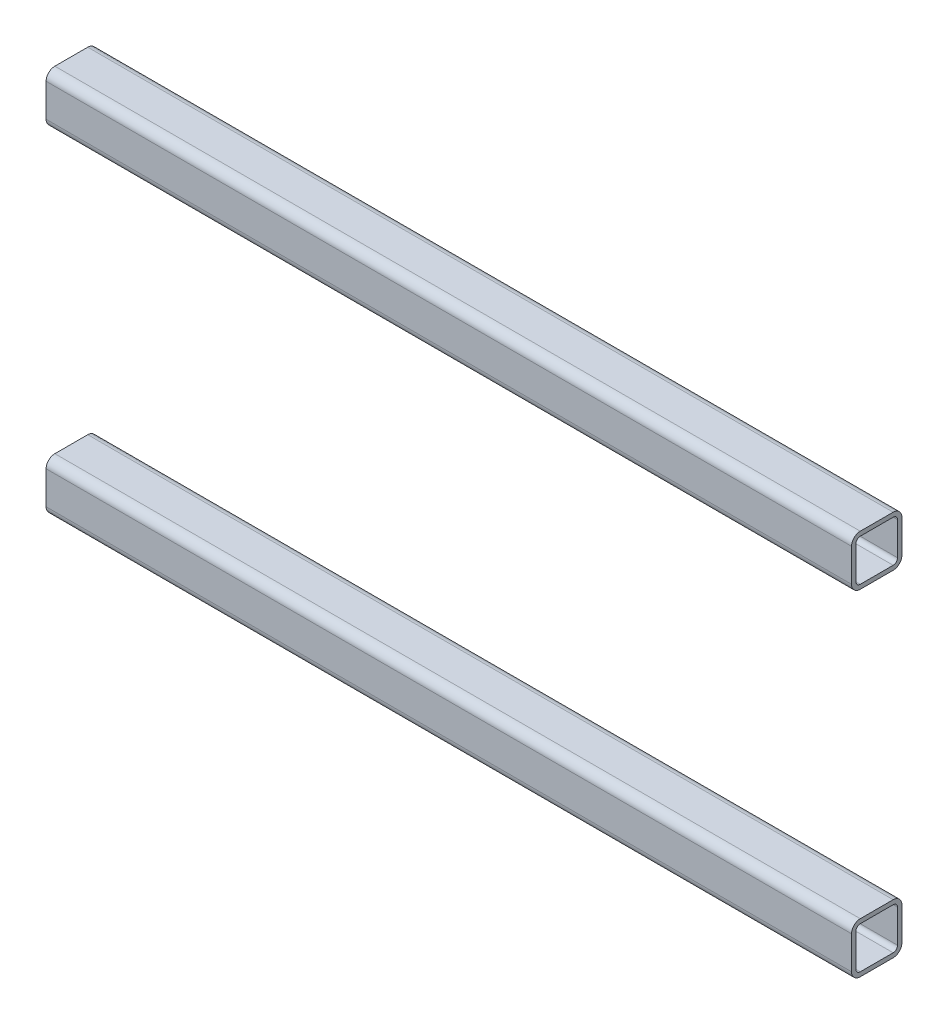
ISO-10303-21;
HEADER;
FILE_DESCRIPTION(('STEP AP214'),'2;1');
FILE_NAME('part.step','',(''),(''),'','','');
FILE_SCHEMA(('AUTOMOTIVE_DESIGN { 1 0 10303 214 1 1 1 1 }'));
ENDSEC;
DATA;
#1=APPLICATION_CONTEXT('core data for automotive mechanical design processes');
#2=APPLICATION_PROTOCOL_DEFINITION('international standard','automotive_design',2000,#1);
#3=PRODUCT_CONTEXT('',#1,'mechanical');
#4=PRODUCT('Part','Part','',(#3));
#5=PRODUCT_RELATED_PRODUCT_CATEGORY('part','',(#4));
#6=PRODUCT_DEFINITION_FORMATION('','',#4);
#7=PRODUCT_DEFINITION_CONTEXT('part definition',#1,'design');
#8=PRODUCT_DEFINITION('design','',#6,#7);
#9=PRODUCT_DEFINITION_SHAPE('','',#8);
#10=(LENGTH_UNIT() NAMED_UNIT(*) SI_UNIT(.MILLI.,.METRE.));
#11=(NAMED_UNIT(*) PLANE_ANGLE_UNIT() SI_UNIT($,.RADIAN.));
#12=(NAMED_UNIT(*) SI_UNIT($,.STERADIAN.) SOLID_ANGLE_UNIT());
#13=UNCERTAINTY_MEASURE_WITH_UNIT(LENGTH_MEASURE(1.E-05),#10,'distance_accuracy_value','');
#14=(GEOMETRIC_REPRESENTATION_CONTEXT(3) GLOBAL_UNCERTAINTY_ASSIGNED_CONTEXT((#13)) GLOBAL_UNIT_ASSIGNED_CONTEXT((#10,
#11,#12)) REPRESENTATION_CONTEXT('',''));
#15=CARTESIAN_POINT('',(0.,0.,0.));
#16=DIRECTION('',(0.,0.,1.));
#17=DIRECTION('',(1.,0.,0.));
#18=AXIS2_PLACEMENT_3D('',#15,#16,#17);
#19=CARTESIAN_POINT('',(480.,9.8,-9.8));
#20=DIRECTION('',(-1.,0.,0.));
#21=DIRECTION('',(0.,0.,1.));
#22=AXIS2_PLACEMENT_3D('',#19,#20,#21);
#23=CYLINDRICAL_SURFACE('',#22,5.19999999999999);
#24=CARTESIAN_POINT('',(0.,9.8,-9.8));
#25=DIRECTION('',(1.,0.,0.));
#26=DIRECTION('',(0.,1.,0.));
#27=AXIS2_PLACEMENT_3D('',#24,#25,#26);
#28=CIRCLE('',#27,5.19999999999999);
#29=CARTESIAN_POINT('',(0.,9.8,-15.));
#30=VERTEX_POINT('',#29);
#31=CARTESIAN_POINT('',(0.,15.,-9.8));
#32=VERTEX_POINT('',#31);
#33=EDGE_CURVE('E262',#30,#32,#28,.T.);
#34=ORIENTED_EDGE('',*,*,#33,.T.);
#35=DIRECTION('',(-1.,0.,0.));
#36=VECTOR('',#35,1.);
#37=CARTESIAN_POINT('',(480.,15.,-9.8));
#38=LINE('',#37,#36);
#39=CARTESIAN_POINT('',(480.,15.,-9.8));
#40=VERTEX_POINT('',#39);
#41=EDGE_CURVE('E13',#40,#32,#38,.T.);
#42=ORIENTED_EDGE('',*,*,#41,.F.);
#43=CARTESIAN_POINT('',(480.,9.8,-9.8));
#44=DIRECTION('',(1.,0.,0.));
#45=DIRECTION('',(0.,1.,0.));
#46=AXIS2_PLACEMENT_3D('',#43,#44,#45);
#47=CIRCLE('',#46,5.19999999999999);
#48=CARTESIAN_POINT('',(480.,9.8,-15.));
#49=VERTEX_POINT('',#48);
#50=EDGE_CURVE('E368',#49,#40,#47,.T.);
#51=ORIENTED_EDGE('',*,*,#50,.F.);
#52=DIRECTION('',(-1.,0.,0.));
#53=VECTOR('',#52,1.);
#54=CARTESIAN_POINT('',(480.,9.8,-15.));
#55=LINE('',#54,#53);
#56=EDGE_CURVE('E285',#49,#30,#55,.T.);
#57=ORIENTED_EDGE('',*,*,#56,.T.);
#58=EDGE_LOOP('',(#34,#42,#51,#57));
#59=FACE_BOUND('',#58,.T.);
#60=ADVANCED_FACE('F77',(#59),#23,.T.);
#61=CARTESIAN_POINT('',(480.,15.,-9.8));
#62=DIRECTION('',(0.,-1.,0.));
#63=DIRECTION('',(0.,0.,-1.));
#64=AXIS2_PLACEMENT_3D('',#61,#62,#63);
#65=PLANE('',#64);
#66=DIRECTION('',(0.,0.,1.));
#67=VECTOR('',#66,1.);
#68=CARTESIAN_POINT('',(0.,15.,-9.8));
#69=LINE('',#68,#67);
#70=CARTESIAN_POINT('',(0.,15.,9.8));
#71=VERTEX_POINT('',#70);
#72=EDGE_CURVE('E266',#32,#71,#69,.T.);
#73=ORIENTED_EDGE('',*,*,#72,.T.);
#74=DIRECTION('',(-1.,0.,0.));
#75=VECTOR('',#74,1.);
#76=CARTESIAN_POINT('',(480.,15.,9.8));
#77=LINE('',#76,#75);
#78=CARTESIAN_POINT('',(480.,15.,9.8));
#79=VERTEX_POINT('',#78);
#80=EDGE_CURVE('E88',#79,#71,#77,.T.);
#81=ORIENTED_EDGE('',*,*,#80,.F.);
#82=DIRECTION('',(0.,0.,1.));
#83=VECTOR('',#82,1.);
#84=CARTESIAN_POINT('',(480.,15.,-9.8));
#85=LINE('',#84,#83);
#86=EDGE_CURVE('E371',#40,#79,#85,.T.);
#87=ORIENTED_EDGE('',*,*,#86,.F.);
#88=ORIENTED_EDGE('',*,*,#41,.T.);
#89=EDGE_LOOP('',(#73,#81,#87,#88));
#90=FACE_BOUND('',#89,.T.);
#91=ADVANCED_FACE('F410',(#90),#65,.F.);
#92=CARTESIAN_POINT('',(480.,9.8,9.8));
#93=DIRECTION('',(-1.,0.,0.));
#94=DIRECTION('',(0.,0.,1.));
#95=AXIS2_PLACEMENT_3D('',#92,#93,#94);
#96=CYLINDRICAL_SURFACE('',#95,5.19999999999999);
#97=CARTESIAN_POINT('',(0.,9.8,9.8));
#98=DIRECTION('',(1.,0.,0.));
#99=DIRECTION('',(0.,1.,0.));
#100=AXIS2_PLACEMENT_3D('',#97,#98,#99);
#101=CIRCLE('',#100,5.19999999999999);
#102=CARTESIAN_POINT('',(0.,9.8,15.));
#103=VERTEX_POINT('',#102);
#104=EDGE_CURVE('E269',#71,#103,#101,.T.);
#105=ORIENTED_EDGE('',*,*,#104,.T.);
#106=DIRECTION('',(-1.,0.,0.));
#107=VECTOR('',#106,1.);
#108=CARTESIAN_POINT('',(480.,9.8,15.));
#109=LINE('',#108,#107);
#110=CARTESIAN_POINT('',(480.,9.8,15.));
#111=VERTEX_POINT('',#110);
#112=EDGE_CURVE('E296',#111,#103,#109,.T.);
#113=ORIENTED_EDGE('',*,*,#112,.F.);
#114=CARTESIAN_POINT('',(480.,9.8,9.8));
#115=DIRECTION('',(1.,0.,0.));
#116=DIRECTION('',(0.,1.,0.));
#117=AXIS2_PLACEMENT_3D('',#114,#115,#116);
#118=CIRCLE('',#117,5.19999999999999);
#119=EDGE_CURVE('E374',#79,#111,#118,.T.);
#120=ORIENTED_EDGE('',*,*,#119,.F.);
#121=ORIENTED_EDGE('',*,*,#80,.T.);
#122=EDGE_LOOP('',(#105,#113,#120,#121));
#123=FACE_BOUND('',#122,.T.);
#124=ADVANCED_FACE('F415',(#123),#96,.T.);
#125=CARTESIAN_POINT('',(480.,-9.8,15.));
#126=DIRECTION('',(0.,0.,-1.));
#127=DIRECTION('',(-1.,0.,0.));
#128=AXIS2_PLACEMENT_3D('',#125,#126,#127);
#129=PLANE('',#128);
#130=DIRECTION('',(0.,-1.,0.));
#131=VECTOR('',#130,1.);
#132=CARTESIAN_POINT('',(0.,-9.8,15.));
#133=LINE('',#132,#131);
#134=CARTESIAN_POINT('',(0.,-9.8,15.));
#135=VERTEX_POINT('',#134);
#136=EDGE_CURVE('E272',#103,#135,#133,.T.);
#137=ORIENTED_EDGE('',*,*,#136,.T.);
#138=DIRECTION('',(-1.,0.,0.));
#139=VECTOR('',#138,1.);
#140=CARTESIAN_POINT('',(480.,-9.8,15.));
#141=LINE('',#140,#139);
#142=CARTESIAN_POINT('',(480.,-9.8,15.));
#143=VERTEX_POINT('',#142);
#144=EDGE_CURVE('E292',#143,#135,#141,.T.);
#145=ORIENTED_EDGE('',*,*,#144,.F.);
#146=DIRECTION('',(0.,-1.,0.));
#147=VECTOR('',#146,1.);
#148=CARTESIAN_POINT('',(480.,-9.8,15.));
#149=LINE('',#148,#147);
#150=EDGE_CURVE('E377',#111,#143,#149,.T.);
#151=ORIENTED_EDGE('',*,*,#150,.F.);
#152=ORIENTED_EDGE('',*,*,#112,.T.);
#153=EDGE_LOOP('',(#137,#145,#151,#152));
#154=FACE_BOUND('',#153,.T.);
#155=ADVANCED_FACE('F385',(#154),#129,.F.);
#156=CARTESIAN_POINT('',(480.,-9.8,9.8));
#157=DIRECTION('',(-1.,0.,0.));
#158=DIRECTION('',(0.,0.,1.));
#159=AXIS2_PLACEMENT_3D('',#156,#157,#158);
#160=CYLINDRICAL_SURFACE('',#159,5.19999999999999);
#161=CARTESIAN_POINT('',(0.,-9.8,9.8));
#162=DIRECTION('',(1.,0.,0.));
#163=DIRECTION('',(0.,1.,0.));
#164=AXIS2_PLACEMENT_3D('',#161,#162,#163);
#165=CIRCLE('',#164,5.19999999999999);
#166=CARTESIAN_POINT('',(0.,-15.,9.8));
#167=VERTEX_POINT('',#166);
#168=EDGE_CURVE('E275',#135,#167,#165,.T.);
#169=ORIENTED_EDGE('',*,*,#168,.T.);
#170=DIRECTION('',(-1.,0.,0.));
#171=VECTOR('',#170,1.);
#172=CARTESIAN_POINT('',(480.,-15.,9.8));
#173=LINE('',#172,#171);
#174=CARTESIAN_POINT('',(480.,-15.,9.8));
#175=VERTEX_POINT('',#174);
#176=EDGE_CURVE('E219',#175,#167,#173,.T.);
#177=ORIENTED_EDGE('',*,*,#176,.F.);
#178=CARTESIAN_POINT('',(480.,-9.8,9.8));
#179=DIRECTION('',(1.,0.,0.));
#180=DIRECTION('',(0.,1.,0.));
#181=AXIS2_PLACEMENT_3D('',#178,#179,#180);
#182=CIRCLE('',#181,5.19999999999999);
#183=EDGE_CURVE('E208',#143,#175,#182,.T.);
#184=ORIENTED_EDGE('',*,*,#183,.F.);
#185=ORIENTED_EDGE('',*,*,#144,.T.);
#186=EDGE_LOOP('',(#169,#177,#184,#185));
#187=FACE_BOUND('',#186,.T.);
#188=ADVANCED_FACE('F389',(#187),#160,.T.);
#189=CARTESIAN_POINT('',(480.,-15.,9.8));
#190=DIRECTION('',(0.,1.,0.));
#191=DIRECTION('',(0.,0.,1.));
#192=AXIS2_PLACEMENT_3D('',#189,#190,#191);
#193=PLANE('',#192);
#194=DIRECTION('',(0.,0.,-1.));
#195=VECTOR('',#194,1.);
#196=CARTESIAN_POINT('',(0.,-15.,9.8));
#197=LINE('',#196,#195);
#198=CARTESIAN_POINT('',(0.,-15.,-9.8));
#199=VERTEX_POINT('',#198);
#200=EDGE_CURVE('E217',#167,#199,#197,.T.);
#201=ORIENTED_EDGE('',*,*,#200,.T.);
#202=DIRECTION('',(-1.,0.,0.));
#203=VECTOR('',#202,1.);
#204=CARTESIAN_POINT('',(480.,-15.,-9.8));
#205=LINE('',#204,#203);
#206=CARTESIAN_POINT('',(480.,-15.,-9.8));
#207=VERTEX_POINT('',#206);
#208=EDGE_CURVE('E214',#207,#199,#205,.T.);
#209=ORIENTED_EDGE('',*,*,#208,.F.);
#210=DIRECTION('',(0.,0.,-1.));
#211=VECTOR('',#210,1.);
#212=CARTESIAN_POINT('',(480.,-15.,9.8));
#213=LINE('',#212,#211);
#214=EDGE_CURVE('E202',#175,#207,#213,.T.);
#215=ORIENTED_EDGE('',*,*,#214,.F.);
#216=ORIENTED_EDGE('',*,*,#176,.T.);
#217=EDGE_LOOP('',(#201,#209,#215,#216));
#218=FACE_BOUND('',#217,.T.);
#219=ADVANCED_FACE('F215',(#218),#193,.F.);
#220=CARTESIAN_POINT('',(480.,-9.8,-9.8));
#221=DIRECTION('',(-1.,0.,0.));
#222=DIRECTION('',(0.,0.,1.));
#223=AXIS2_PLACEMENT_3D('',#220,#221,#222);
#224=CYLINDRICAL_SURFACE('',#223,5.19999999999999);
#225=CARTESIAN_POINT('',(0.,-9.8,-9.8));
#226=DIRECTION('',(1.,0.,0.));
#227=DIRECTION('',(0.,1.,0.));
#228=AXIS2_PLACEMENT_3D('',#225,#226,#227);
#229=CIRCLE('',#228,5.19999999999999);
#230=CARTESIAN_POINT('',(0.,-9.8,-15.));
#231=VERTEX_POINT('',#230);
#232=EDGE_CURVE('E150',#199,#231,#229,.T.);
#233=ORIENTED_EDGE('',*,*,#232,.T.);
#234=DIRECTION('',(-1.,0.,0.));
#235=VECTOR('',#234,1.);
#236=CARTESIAN_POINT('',(480.,-9.8,-15.));
#237=LINE('',#236,#235);
#238=CARTESIAN_POINT('',(480.,-9.8,-15.));
#239=VERTEX_POINT('',#238);
#240=EDGE_CURVE('E220',#239,#231,#237,.T.);
#241=ORIENTED_EDGE('',*,*,#240,.F.);
#242=CARTESIAN_POINT('',(480.,-9.8,-9.8));
#243=DIRECTION('',(1.,0.,0.));
#244=DIRECTION('',(0.,1.,0.));
#245=AXIS2_PLACEMENT_3D('',#242,#243,#244);
#246=CIRCLE('',#245,5.19999999999999);
#247=EDGE_CURVE('E206',#207,#239,#246,.T.);
#248=ORIENTED_EDGE('',*,*,#247,.F.);
#249=ORIENTED_EDGE('',*,*,#208,.T.);
#250=EDGE_LOOP('',(#233,#241,#248,#249));
#251=FACE_BOUND('',#250,.T.);
#252=ADVANCED_FACE('F222',(#251),#224,.T.);
#253=CARTESIAN_POINT('',(480.,9.8,9.8));
#254=DIRECTION('',(-1.,0.,0.));
#255=DIRECTION('',(0.,0.,1.));
#256=AXIS2_PLACEMENT_3D('',#253,#254,#255);
#257=CYLINDRICAL_SURFACE('',#256,2.59999999999999);
#258=CARTESIAN_POINT('',(0.,9.8,9.8));
#259=DIRECTION('',(1.,0.,0.));
#260=DIRECTION('',(0.,1.,0.));
#261=AXIS2_PLACEMENT_3D('',#258,#259,#260);
#262=CIRCLE('',#261,2.59999999999999);
#263=CARTESIAN_POINT('',(0.,12.4,9.8));
#264=VERTEX_POINT('',#263);
#265=CARTESIAN_POINT('',(0.,9.8,12.4));
#266=VERTEX_POINT('',#265);
#267=EDGE_CURVE('E230',#264,#266,#262,.T.);
#268=ORIENTED_EDGE('',*,*,#267,.F.);
#269=DIRECTION('',(-1.,0.,0.));
#270=VECTOR('',#269,1.);
#271=CARTESIAN_POINT('',(480.,12.4,9.8));
#272=LINE('',#271,#270);
#273=CARTESIAN_POINT('',(480.,12.4,9.8));
#274=VERTEX_POINT('',#273);
#275=EDGE_CURVE('E81',#274,#264,#272,.T.);
#276=ORIENTED_EDGE('',*,*,#275,.F.);
#277=CARTESIAN_POINT('',(480.,9.8,9.8));
#278=DIRECTION('',(1.,0.,0.));
#279=DIRECTION('',(0.,1.,0.));
#280=AXIS2_PLACEMENT_3D('',#277,#278,#279);
#281=CIRCLE('',#280,2.59999999999999);
#282=CARTESIAN_POINT('',(480.,9.8,12.4));
#283=VERTEX_POINT('',#282);
#284=EDGE_CURVE('E284',#274,#283,#281,.T.);
#285=ORIENTED_EDGE('',*,*,#284,.T.);
#286=DIRECTION('',(-1.,0.,0.));
#287=VECTOR('',#286,1.);
#288=CARTESIAN_POINT('',(480.,9.8,12.4));
#289=LINE('',#288,#287);
#290=EDGE_CURVE('E226',#283,#266,#289,.T.);
#291=ORIENTED_EDGE('',*,*,#290,.T.);
#292=EDGE_LOOP('',(#268,#276,#285,#291));
#293=FACE_BOUND('',#292,.T.);
#294=ADVANCED_FACE('F79',(#293),#257,.F.);
#295=CARTESIAN_POINT('',(480.,12.4,-9.8));
#296=DIRECTION('',(0.,-1.,0.));
#297=DIRECTION('',(0.,0.,-1.));
#298=AXIS2_PLACEMENT_3D('',#295,#296,#297);
#299=PLANE('',#298);
#300=DIRECTION('',(0.,0.,1.));
#301=VECTOR('',#300,1.);
#302=CARTESIAN_POINT('',(0.,12.4,-9.8));
#303=LINE('',#302,#301);
#304=CARTESIAN_POINT('',(0.,12.4,-9.8));
#305=VERTEX_POINT('',#304);
#306=EDGE_CURVE('E234',#305,#264,#303,.T.);
#307=ORIENTED_EDGE('',*,*,#306,.F.);
#308=DIRECTION('',(-1.,0.,0.));
#309=VECTOR('',#308,1.);
#310=CARTESIAN_POINT('',(480.,12.4,-9.8));
#311=LINE('',#310,#309);
#312=CARTESIAN_POINT('',(480.,12.4,-9.8));
#313=VERTEX_POINT('',#312);
#314=EDGE_CURVE('E319',#313,#305,#311,.T.);
#315=ORIENTED_EDGE('',*,*,#314,.F.);
#316=DIRECTION('',(0.,0.,1.));
#317=VECTOR('',#316,1.);
#318=CARTESIAN_POINT('',(480.,12.4,-9.8));
#319=LINE('',#318,#317);
#320=EDGE_CURVE('E330',#313,#274,#319,.T.);
#321=ORIENTED_EDGE('',*,*,#320,.T.);
#322=ORIENTED_EDGE('',*,*,#275,.T.);
#323=EDGE_LOOP('',(#307,#315,#321,#322));
#324=FACE_BOUND('',#323,.T.);
#325=ADVANCED_FACE('F328',(#324),#299,.T.);
#326=CARTESIAN_POINT('',(480.,9.8,-9.8));
#327=DIRECTION('',(-1.,0.,0.));
#328=DIRECTION('',(0.,0.,1.));
#329=AXIS2_PLACEMENT_3D('',#326,#327,#328);
#330=CYLINDRICAL_SURFACE('',#329,2.59999999999999);
#331=CARTESIAN_POINT('',(0.,9.8,-9.8));
#332=DIRECTION('',(1.,0.,0.));
#333=DIRECTION('',(0.,1.,0.));
#334=AXIS2_PLACEMENT_3D('',#331,#332,#333);
#335=CIRCLE('',#334,2.59999999999999);
#336=CARTESIAN_POINT('',(0.,9.8,-12.4));
#337=VERTEX_POINT('',#336);
#338=EDGE_CURVE('E238',#337,#305,#335,.T.);
#339=ORIENTED_EDGE('',*,*,#338,.F.);
#340=DIRECTION('',(-1.,0.,0.));
#341=VECTOR('',#340,1.);
#342=CARTESIAN_POINT('',(480.,9.8,-12.4));
#343=LINE('',#342,#341);
#344=CARTESIAN_POINT('',(480.,9.8,-12.4));
#345=VERTEX_POINT('',#344);
#346=EDGE_CURVE('E317',#345,#337,#343,.T.);
#347=ORIENTED_EDGE('',*,*,#346,.F.);
#348=CARTESIAN_POINT('',(480.,9.8,-9.8));
#349=DIRECTION('',(1.,0.,0.));
#350=DIRECTION('',(0.,1.,0.));
#351=AXIS2_PLACEMENT_3D('',#348,#349,#350);
#352=CIRCLE('',#351,2.59999999999999);
#353=EDGE_CURVE('E338',#345,#313,#352,.T.);
#354=ORIENTED_EDGE('',*,*,#353,.T.);
#355=ORIENTED_EDGE('',*,*,#314,.T.);
#356=EDGE_LOOP('',(#339,#347,#354,#355));
#357=FACE_BOUND('',#356,.T.);
#358=ADVANCED_FACE('F336',(#357),#330,.F.);
#359=CARTESIAN_POINT('',(480.,9.8,-12.4));
#360=DIRECTION('',(0.,0.,1.));
#361=DIRECTION('',(1.,0.,0.));
#362=AXIS2_PLACEMENT_3D('',#359,#360,#361);
#363=PLANE('',#362);
#364=DIRECTION('',(0.,1.,0.));
#365=VECTOR('',#364,1.);
#366=CARTESIAN_POINT('',(0.,9.8,-12.4));
#367=LINE('',#366,#365);
#368=CARTESIAN_POINT('',(0.,-9.8,-12.4));
#369=VERTEX_POINT('',#368);
#370=EDGE_CURVE('E242',#369,#337,#367,.T.);
#371=ORIENTED_EDGE('',*,*,#370,.F.);
#372=DIRECTION('',(-1.,0.,0.));
#373=VECTOR('',#372,1.);
#374=CARTESIAN_POINT('',(480.,-9.8,-12.4));
#375=LINE('',#374,#373);
#376=CARTESIAN_POINT('',(480.,-9.8,-12.4));
#377=VERTEX_POINT('',#376);
#378=EDGE_CURVE('E314',#377,#369,#375,.T.);
#379=ORIENTED_EDGE('',*,*,#378,.F.);
#380=DIRECTION('',(0.,1.,0.));
#381=VECTOR('',#380,1.);
#382=CARTESIAN_POINT('',(480.,9.8,-12.4));
#383=LINE('',#382,#381);
#384=EDGE_CURVE('E344',#377,#345,#383,.T.);
#385=ORIENTED_EDGE('',*,*,#384,.T.);
#386=ORIENTED_EDGE('',*,*,#346,.T.);
#387=EDGE_LOOP('',(#371,#379,#385,#386));
#388=FACE_BOUND('',#387,.T.);
#389=ADVANCED_FACE('F348',(#388),#363,.T.);
#390=CARTESIAN_POINT('',(480.,-9.8,-9.8));
#391=DIRECTION('',(-1.,0.,0.));
#392=DIRECTION('',(0.,0.,1.));
#393=AXIS2_PLACEMENT_3D('',#390,#391,#392);
#394=CYLINDRICAL_SURFACE('',#393,2.6);
#395=CARTESIAN_POINT('',(0.,-9.8,-9.8));
#396=DIRECTION('',(1.,0.,0.));
#397=DIRECTION('',(0.,1.,0.));
#398=AXIS2_PLACEMENT_3D('',#395,#396,#397);
#399=CIRCLE('',#398,2.6);
#400=CARTESIAN_POINT('',(0.,-12.4,-9.8));
#401=VERTEX_POINT('',#400);
#402=EDGE_CURVE('E246',#401,#369,#399,.T.);
#403=ORIENTED_EDGE('',*,*,#402,.F.);
#404=DIRECTION('',(-1.,0.,0.));
#405=VECTOR('',#404,1.);
#406=CARTESIAN_POINT('',(480.,-12.4,-9.8));
#407=LINE('',#406,#405);
#408=CARTESIAN_POINT('',(480.,-12.4,-9.8));
#409=VERTEX_POINT('',#408);
#410=EDGE_CURVE('E311',#409,#401,#407,.T.);
#411=ORIENTED_EDGE('',*,*,#410,.F.);
#412=CARTESIAN_POINT('',(480.,-9.8,-9.8));
#413=DIRECTION('',(1.,0.,0.));
#414=DIRECTION('',(0.,1.,0.));
#415=AXIS2_PLACEMENT_3D('',#412,#413,#414);
#416=CIRCLE('',#415,2.6);
#417=EDGE_CURVE('E350',#409,#377,#416,.T.);
#418=ORIENTED_EDGE('',*,*,#417,.T.);
#419=ORIENTED_EDGE('',*,*,#378,.T.);
#420=EDGE_LOOP('',(#403,#411,#418,#419));
#421=FACE_BOUND('',#420,.T.);
#422=ADVANCED_FACE('F426',(#421),#394,.F.);
#423=CARTESIAN_POINT('',(480.,-12.4,9.8));
#424=DIRECTION('',(0.,1.,0.));
#425=DIRECTION('',(0.,0.,1.));
#426=AXIS2_PLACEMENT_3D('',#423,#424,#425);
#427=PLANE('',#426);
#428=DIRECTION('',(0.,0.,-1.));
#429=VECTOR('',#428,1.);
#430=CARTESIAN_POINT('',(0.,-12.4,9.8));
#431=LINE('',#430,#429);
#432=CARTESIAN_POINT('',(0.,-12.4,9.8));
#433=VERTEX_POINT('',#432);
#434=EDGE_CURVE('E250',#433,#401,#431,.T.);
#435=ORIENTED_EDGE('',*,*,#434,.F.);
#436=DIRECTION('',(-1.,0.,0.));
#437=VECTOR('',#436,1.);
#438=CARTESIAN_POINT('',(480.,-12.4,9.8));
#439=LINE('',#438,#437);
#440=CARTESIAN_POINT('',(480.,-12.4,9.8));
#441=VERTEX_POINT('',#440);
#442=EDGE_CURVE('E308',#441,#433,#439,.T.);
#443=ORIENTED_EDGE('',*,*,#442,.F.);
#444=DIRECTION('',(0.,0.,-1.));
#445=VECTOR('',#444,1.);
#446=CARTESIAN_POINT('',(480.,-12.4,9.8));
#447=LINE('',#446,#445);
#448=EDGE_CURVE('E353',#441,#409,#447,.T.);
#449=ORIENTED_EDGE('',*,*,#448,.T.);
#450=ORIENTED_EDGE('',*,*,#410,.T.);
#451=EDGE_LOOP('',(#435,#443,#449,#450));
#452=FACE_BOUND('',#451,.T.);
#453=ADVANCED_FACE('F422',(#452),#427,.T.);
#454=CARTESIAN_POINT('',(480.,-9.8,9.8));
#455=DIRECTION('',(-1.,0.,0.));
#456=DIRECTION('',(0.,0.,1.));
#457=AXIS2_PLACEMENT_3D('',#454,#455,#456);
#458=CYLINDRICAL_SURFACE('',#457,2.59999999999999);
#459=CARTESIAN_POINT('',(0.,-9.8,9.8));
#460=DIRECTION('',(1.,0.,0.));
#461=DIRECTION('',(0.,1.,0.));
#462=AXIS2_PLACEMENT_3D('',#459,#460,#461);
#463=CIRCLE('',#462,2.59999999999999);
#464=CARTESIAN_POINT('',(0.,-9.8,12.4));
#465=VERTEX_POINT('',#464);
#466=EDGE_CURVE('E254',#465,#433,#463,.T.);
#467=ORIENTED_EDGE('',*,*,#466,.F.);
#468=DIRECTION('',(-1.,0.,0.));
#469=VECTOR('',#468,1.);
#470=CARTESIAN_POINT('',(480.,-9.8,12.4));
#471=LINE('',#470,#469);
#472=CARTESIAN_POINT('',(480.,-9.8,12.4));
#473=VERTEX_POINT('',#472);
#474=EDGE_CURVE('E305',#473,#465,#471,.T.);
#475=ORIENTED_EDGE('',*,*,#474,.F.);
#476=CARTESIAN_POINT('',(480.,-9.8,9.8));
#477=DIRECTION('',(1.,0.,0.));
#478=DIRECTION('',(0.,1.,0.));
#479=AXIS2_PLACEMENT_3D('',#476,#477,#478);
#480=CIRCLE('',#479,2.59999999999999);
#481=EDGE_CURVE('E360',#473,#441,#480,.T.);
#482=ORIENTED_EDGE('',*,*,#481,.T.);
#483=ORIENTED_EDGE('',*,*,#442,.T.);
#484=EDGE_LOOP('',(#467,#475,#482,#483));
#485=FACE_BOUND('',#484,.T.);
#486=ADVANCED_FACE('F404',(#485),#458,.F.);
#487=CARTESIAN_POINT('',(480.,-9.8,12.4));
#488=DIRECTION('',(0.,0.,-1.));
#489=DIRECTION('',(-1.,0.,0.));
#490=AXIS2_PLACEMENT_3D('',#487,#488,#489);
#491=PLANE('',#490);
#492=DIRECTION('',(0.,-1.,0.));
#493=VECTOR('',#492,1.);
#494=CARTESIAN_POINT('',(0.,-9.8,12.4));
#495=LINE('',#494,#493);
#496=EDGE_CURVE('E258',#266,#465,#495,.T.);
#497=ORIENTED_EDGE('',*,*,#496,.F.);
#498=ORIENTED_EDGE('',*,*,#290,.F.);
#499=DIRECTION('',(0.,-1.,0.));
#500=VECTOR('',#499,1.);
#501=CARTESIAN_POINT('',(480.,-9.8,12.4));
#502=LINE('',#501,#500);
#503=EDGE_CURVE('E364',#283,#473,#502,.T.);
#504=ORIENTED_EDGE('',*,*,#503,.T.);
#505=ORIENTED_EDGE('',*,*,#474,.T.);
#506=EDGE_LOOP('',(#497,#498,#504,#505));
#507=FACE_BOUND('',#506,.T.);
#508=ADVANCED_FACE('F397',(#507),#491,.T.);
#509=CARTESIAN_POINT('',(480.,9.8,-15.));
#510=DIRECTION('',(0.,0.,1.));
#511=DIRECTION('',(1.,0.,0.));
#512=AXIS2_PLACEMENT_3D('',#509,#510,#511);
#513=PLANE('',#512);
#514=DIRECTION('',(0.,1.,0.));
#515=VECTOR('',#514,1.);
#516=CARTESIAN_POINT('',(0.,9.8,-15.));
#517=LINE('',#516,#515);
#518=EDGE_CURVE('E156',#231,#30,#517,.T.);
#519=ORIENTED_EDGE('',*,*,#518,.T.);
#520=ORIENTED_EDGE('',*,*,#56,.F.);
#521=DIRECTION('',(0.,1.,0.));
#522=VECTOR('',#521,1.);
#523=CARTESIAN_POINT('',(480.,9.8,-15.));
#524=LINE('',#523,#522);
#525=EDGE_CURVE('E97',#239,#49,#524,.T.);
#526=ORIENTED_EDGE('',*,*,#525,.F.);
#527=ORIENTED_EDGE('',*,*,#240,.T.);
#528=EDGE_LOOP('',(#519,#520,#526,#527));
#529=FACE_BOUND('',#528,.T.);
#530=ADVANCED_FACE('F395',(#529),#513,.F.);
#531=CARTESIAN_POINT('',(480.,9.8,-9.8));
#532=DIRECTION('',(1.,0.,0.));
#533=DIRECTION('',(0.,1.,0.));
#534=AXIS2_PLACEMENT_3D('',#531,#532,#533);
#535=PLANE('',#534);
#536=ORIENTED_EDGE('',*,*,#284,.F.);
#537=ORIENTED_EDGE('',*,*,#320,.F.);
#538=ORIENTED_EDGE('',*,*,#353,.F.);
#539=ORIENTED_EDGE('',*,*,#384,.F.);
#540=ORIENTED_EDGE('',*,*,#417,.F.);
#541=ORIENTED_EDGE('',*,*,#448,.F.);
#542=ORIENTED_EDGE('',*,*,#481,.F.);
#543=ORIENTED_EDGE('',*,*,#503,.F.);
#544=EDGE_LOOP('',(#536,#537,#538,#539,#540,#541,#542,#543));
#545=FACE_BOUND('',#544,.T.);
#546=ORIENTED_EDGE('',*,*,#50,.T.);
#547=ORIENTED_EDGE('',*,*,#86,.T.);
#548=ORIENTED_EDGE('',*,*,#119,.T.);
#549=ORIENTED_EDGE('',*,*,#150,.T.);
#550=ORIENTED_EDGE('',*,*,#183,.T.);
#551=ORIENTED_EDGE('',*,*,#214,.T.);
#552=ORIENTED_EDGE('',*,*,#247,.T.);
#553=ORIENTED_EDGE('',*,*,#525,.T.);
#554=EDGE_LOOP('',(#546,#547,#548,#549,#550,#551,#552,#553));
#555=FACE_BOUND('',#554,.T.);
#556=ADVANCED_FACE('F204',(#545,#555),#535,.T.);
#557=CARTESIAN_POINT('',(0.,9.8,-9.8));
#558=DIRECTION('',(1.,0.,0.));
#559=DIRECTION('',(0.,1.,0.));
#560=AXIS2_PLACEMENT_3D('',#557,#558,#559);
#561=PLANE('',#560);
#562=ORIENTED_EDGE('',*,*,#267,.T.);
#563=ORIENTED_EDGE('',*,*,#496,.T.);
#564=ORIENTED_EDGE('',*,*,#466,.T.);
#565=ORIENTED_EDGE('',*,*,#434,.T.);
#566=ORIENTED_EDGE('',*,*,#402,.T.);
#567=ORIENTED_EDGE('',*,*,#370,.T.);
#568=ORIENTED_EDGE('',*,*,#338,.T.);
#569=ORIENTED_EDGE('',*,*,#306,.T.);
#570=EDGE_LOOP('',(#562,#563,#564,#565,#566,#567,#568,#569));
#571=FACE_BOUND('',#570,.T.);
#572=ORIENTED_EDGE('',*,*,#33,.F.);
#573=ORIENTED_EDGE('',*,*,#518,.F.);
#574=ORIENTED_EDGE('',*,*,#232,.F.);
#575=ORIENTED_EDGE('',*,*,#200,.F.);
#576=ORIENTED_EDGE('',*,*,#168,.F.);
#577=ORIENTED_EDGE('',*,*,#136,.F.);
#578=ORIENTED_EDGE('',*,*,#104,.F.);
#579=ORIENTED_EDGE('',*,*,#72,.F.);
#580=EDGE_LOOP('',(#572,#573,#574,#575,#576,#577,#578,#579));
#581=FACE_BOUND('',#580,.T.);
#582=ADVANCED_FACE('F333',(#571,#581),#561,.F.);
#583=CLOSED_SHELL('',(#60,#91,#124,#155,#188,#219,#252,#294,#325,#358,#389,#422,#453,#486,#508,
#530,#556,#582));
#584=MANIFOLD_SOLID_BREP('B2',#583);
#585=CARTESIAN_POINT('',(480.,209.8,-9.80000000000001));
#586=DIRECTION('',(-1.,0.,0.));
#587=DIRECTION('',(0.,-1.,0.));
#588=AXIS2_PLACEMENT_3D('',#585,#586,#587);
#589=CYLINDRICAL_SURFACE('',#588,5.19999999999999);
#590=CARTESIAN_POINT('',(0.,209.8,-9.8));
#591=DIRECTION('',(1.,0.,0.));
#592=DIRECTION('',(0.,1.,0.));
#593=AXIS2_PLACEMENT_3D('',#590,#591,#592);
#594=CIRCLE('',#593,5.19999999999999);
#595=CARTESIAN_POINT('',(0.,209.8,-15.));
#596=VERTEX_POINT('',#595);
#597=CARTESIAN_POINT('',(0.,215.,-9.8));
#598=VERTEX_POINT('',#597);
#599=EDGE_CURVE('E771',#596,#598,#594,.T.);
#600=ORIENTED_EDGE('',*,*,#599,.T.);
#601=DIRECTION('',(-1.,0.,0.));
#602=VECTOR('',#601,1.);
#603=CARTESIAN_POINT('',(480.,215.,-9.80000000000002));
#604=LINE('',#603,#602);
#605=CARTESIAN_POINT('',(480.,215.,-9.80000000000002));
#606=VERTEX_POINT('',#605);
#607=EDGE_CURVE('E75',#606,#598,#604,.T.);
#608=ORIENTED_EDGE('',*,*,#607,.F.);
#609=CARTESIAN_POINT('',(480.,209.8,-9.80000000000001));
#610=DIRECTION('',(1.,0.,0.));
#611=DIRECTION('',(0.,1.,0.));
#612=AXIS2_PLACEMENT_3D('',#609,#610,#611);
#613=CIRCLE('',#612,5.19999999999999);
#614=CARTESIAN_POINT('',(480.,209.8,-15.));
#615=VERTEX_POINT('',#614);
#616=EDGE_CURVE('E849',#615,#606,#613,.T.);
#617=ORIENTED_EDGE('',*,*,#616,.F.);
#618=DIRECTION('',(-1.,0.,0.));
#619=VECTOR('',#618,1.);
#620=CARTESIAN_POINT('',(480.,209.8,-15.));
#621=LINE('',#620,#619);
#622=EDGE_CURVE('E786',#615,#596,#621,.T.);
#623=ORIENTED_EDGE('',*,*,#622,.T.);
#624=EDGE_LOOP('',(#600,#608,#617,#623));
#625=FACE_BOUND('',#624,.T.);
#626=ADVANCED_FACE('F599',(#625),#589,.T.);
#627=CARTESIAN_POINT('',(480.,215.,-9.80000000000002));
#628=DIRECTION('',(0.,-1.,0.));
#629=DIRECTION('',(1.,0.,0.));
#630=AXIS2_PLACEMENT_3D('',#627,#628,#629);
#631=PLANE('',#630);
#632=DIRECTION('',(0.,0.,1.));
#633=VECTOR('',#632,1.);
#634=CARTESIAN_POINT('',(0.,215.,-9.8));
#635=LINE('',#634,#633);
#636=CARTESIAN_POINT('',(0.,215.,9.8));
#637=VERTEX_POINT('',#636);
#638=EDGE_CURVE('E774',#598,#637,#635,.T.);
#639=ORIENTED_EDGE('',*,*,#638,.T.);
#640=DIRECTION('',(-1.,0.,0.));
#641=VECTOR('',#640,1.);
#642=CARTESIAN_POINT('',(480.,215.,9.79999999999999));
#643=LINE('',#642,#641);
#644=CARTESIAN_POINT('',(480.,215.,9.79999999999999));
#645=VERTEX_POINT('',#644);
#646=EDGE_CURVE('E609',#645,#637,#643,.T.);
#647=ORIENTED_EDGE('',*,*,#646,.F.);
#648=DIRECTION('',(0.,0.,1.));
#649=VECTOR('',#648,1.);
#650=CARTESIAN_POINT('',(480.,215.,-9.80000000000002));
#651=LINE('',#650,#649);
#652=EDGE_CURVE('E851',#606,#645,#651,.T.);
#653=ORIENTED_EDGE('',*,*,#652,.F.);
#654=ORIENTED_EDGE('',*,*,#607,.T.);
#655=EDGE_LOOP('',(#639,#647,#653,#654));
#656=FACE_BOUND('',#655,.T.);
#657=ADVANCED_FACE('F886',(#656),#631,.F.);
#658=CARTESIAN_POINT('',(480.,209.8,9.79999999999999));
#659=DIRECTION('',(-1.,0.,0.));
#660=DIRECTION('',(0.,-1.,0.));
#661=AXIS2_PLACEMENT_3D('',#658,#659,#660);
#662=CYLINDRICAL_SURFACE('',#661,5.19999999999999);
#663=CARTESIAN_POINT('',(0.,209.8,9.8));
#664=DIRECTION('',(1.,0.,0.));
#665=DIRECTION('',(0.,1.,0.));
#666=AXIS2_PLACEMENT_3D('',#663,#664,#665);
#667=CIRCLE('',#666,5.19999999999999);
#668=CARTESIAN_POINT('',(0.,209.8,15.));
#669=VERTEX_POINT('',#668);
#670=EDGE_CURVE('E776',#637,#669,#667,.T.);
#671=ORIENTED_EDGE('',*,*,#670,.T.);
#672=DIRECTION('',(-1.,0.,0.));
#673=VECTOR('',#672,1.);
#674=CARTESIAN_POINT('',(480.,209.8,15.));
#675=LINE('',#674,#673);
#676=CARTESIAN_POINT('',(480.,209.8,15.));
#677=VERTEX_POINT('',#676);
#678=EDGE_CURVE('E793',#677,#669,#675,.T.);
#679=ORIENTED_EDGE('',*,*,#678,.F.);
#680=CARTESIAN_POINT('',(480.,209.8,9.79999999999999));
#681=DIRECTION('',(1.,0.,0.));
#682=DIRECTION('',(0.,1.,0.));
#683=AXIS2_PLACEMENT_3D('',#680,#681,#682);
#684=CIRCLE('',#683,5.19999999999999);
#685=EDGE_CURVE('E853',#645,#677,#684,.T.);
#686=ORIENTED_EDGE('',*,*,#685,.F.);
#687=ORIENTED_EDGE('',*,*,#646,.T.);
#688=EDGE_LOOP('',(#671,#679,#686,#687));
#689=FACE_BOUND('',#688,.T.);
#690=ADVANCED_FACE('F891',(#689),#662,.T.);
#691=CARTESIAN_POINT('',(480.,190.2,15.));
#692=DIRECTION('',(0.,0.,-1.));
#693=DIRECTION('',(-1.,0.,0.));
#694=AXIS2_PLACEMENT_3D('',#691,#692,#693);
#695=PLANE('',#694);
#696=DIRECTION('',(0.,-1.,0.));
#697=VECTOR('',#696,1.);
#698=CARTESIAN_POINT('',(0.,190.2,15.));
#699=LINE('',#698,#697);
#700=CARTESIAN_POINT('',(0.,190.2,15.));
#701=VERTEX_POINT('',#700);
#702=EDGE_CURVE('E778',#669,#701,#699,.T.);
#703=ORIENTED_EDGE('',*,*,#702,.T.);
#704=DIRECTION('',(-1.,0.,0.));
#705=VECTOR('',#704,1.);
#706=CARTESIAN_POINT('',(480.,190.2,15.));
#707=LINE('',#706,#705);
#708=CARTESIAN_POINT('',(480.,190.2,15.));
#709=VERTEX_POINT('',#708);
#710=EDGE_CURVE('E790',#709,#701,#707,.T.);
#711=ORIENTED_EDGE('',*,*,#710,.F.);
#712=DIRECTION('',(0.,-1.,0.));
#713=VECTOR('',#712,1.);
#714=CARTESIAN_POINT('',(480.,190.2,15.));
#715=LINE('',#714,#713);
#716=EDGE_CURVE('E855',#677,#709,#715,.T.);
#717=ORIENTED_EDGE('',*,*,#716,.F.);
#718=ORIENTED_EDGE('',*,*,#678,.T.);
#719=EDGE_LOOP('',(#703,#711,#717,#718));
#720=FACE_BOUND('',#719,.T.);
#721=ADVANCED_FACE('F861',(#720),#695,.F.);
#722=CARTESIAN_POINT('',(480.,190.2,9.79999999999999));
#723=DIRECTION('',(-1.,0.,0.));
#724=DIRECTION('',(0.,-1.,0.));
#725=AXIS2_PLACEMENT_3D('',#722,#723,#724);
#726=CYLINDRICAL_SURFACE('',#725,5.19999999999999);
#727=CARTESIAN_POINT('',(0.,190.2,9.8));
#728=DIRECTION('',(1.,0.,0.));
#729=DIRECTION('',(0.,1.,0.));
#730=AXIS2_PLACEMENT_3D('',#727,#728,#729);
#731=CIRCLE('',#730,5.19999999999999);
#732=CARTESIAN_POINT('',(0.,185.,9.8));
#733=VERTEX_POINT('',#732);
#734=EDGE_CURVE('E780',#701,#733,#731,.T.);
#735=ORIENTED_EDGE('',*,*,#734,.T.);
#736=DIRECTION('',(-1.,0.,0.));
#737=VECTOR('',#736,1.);
#738=CARTESIAN_POINT('',(480.,185.,9.79999999999999));
#739=LINE('',#738,#737);
#740=CARTESIAN_POINT('',(480.,185.,9.79999999999999));
#741=VERTEX_POINT('',#740);
#742=EDGE_CURVE('E738',#741,#733,#739,.T.);
#743=ORIENTED_EDGE('',*,*,#742,.F.);
#744=CARTESIAN_POINT('',(480.,190.2,9.79999999999999));
#745=DIRECTION('',(1.,0.,0.));
#746=DIRECTION('',(0.,1.,0.));
#747=AXIS2_PLACEMENT_3D('',#744,#745,#746);
#748=CIRCLE('',#747,5.19999999999999);
#749=EDGE_CURVE('E729',#709,#741,#748,.T.);
#750=ORIENTED_EDGE('',*,*,#749,.F.);
#751=ORIENTED_EDGE('',*,*,#710,.T.);
#752=EDGE_LOOP('',(#735,#743,#750,#751));
#753=FACE_BOUND('',#752,.T.);
#754=ADVANCED_FACE('F865',(#753),#726,.T.);
#755=CARTESIAN_POINT('',(480.,185.,9.79999999999999));
#756=DIRECTION('',(0.,1.,0.));
#757=DIRECTION('',(-1.,0.,0.));
#758=AXIS2_PLACEMENT_3D('',#755,#756,#757);
#759=PLANE('',#758);
#760=DIRECTION('',(0.,0.,-1.));
#761=VECTOR('',#760,1.);
#762=CARTESIAN_POINT('',(0.,185.,9.8));
#763=LINE('',#762,#761);
#764=CARTESIAN_POINT('',(0.,185.,-9.8));
#765=VERTEX_POINT('',#764);
#766=EDGE_CURVE('E737',#733,#765,#763,.T.);
#767=ORIENTED_EDGE('',*,*,#766,.T.);
#768=DIRECTION('',(-1.,0.,0.));
#769=VECTOR('',#768,1.);
#770=CARTESIAN_POINT('',(480.,185.,-9.80000000000001));
#771=LINE('',#770,#769);
#772=CARTESIAN_POINT('',(480.,185.,-9.80000000000001));
#773=VERTEX_POINT('',#772);
#774=EDGE_CURVE('E734',#773,#765,#771,.T.);
#775=ORIENTED_EDGE('',*,*,#774,.F.);
#776=DIRECTION('',(0.,0.,-1.));
#777=VECTOR('',#776,1.);
#778=CARTESIAN_POINT('',(480.,185.,9.79999999999999));
#779=LINE('',#778,#777);
#780=EDGE_CURVE('E723',#741,#773,#779,.T.);
#781=ORIENTED_EDGE('',*,*,#780,.F.);
#782=ORIENTED_EDGE('',*,*,#742,.T.);
#783=EDGE_LOOP('',(#767,#775,#781,#782));
#784=FACE_BOUND('',#783,.T.);
#785=ADVANCED_FACE('F735',(#784),#759,.F.);
#786=CARTESIAN_POINT('',(480.,190.2,-9.80000000000001));
#787=DIRECTION('',(-1.,0.,0.));
#788=DIRECTION('',(0.,-1.,0.));
#789=AXIS2_PLACEMENT_3D('',#786,#787,#788);
#790=CYLINDRICAL_SURFACE('',#789,5.19999999999999);
#791=CARTESIAN_POINT('',(0.,190.2,-9.8));
#792=DIRECTION('',(1.,0.,0.));
#793=DIRECTION('',(0.,1.,0.));
#794=AXIS2_PLACEMENT_3D('',#791,#792,#793);
#795=CIRCLE('',#794,5.19999999999999);
#796=CARTESIAN_POINT('',(0.,190.2,-15.));
#797=VERTEX_POINT('',#796);
#798=EDGE_CURVE('E671',#765,#797,#795,.T.);
#799=ORIENTED_EDGE('',*,*,#798,.T.);
#800=DIRECTION('',(-1.,0.,0.));
#801=VECTOR('',#800,1.);
#802=CARTESIAN_POINT('',(480.,190.2,-15.));
#803=LINE('',#802,#801);
#804=CARTESIAN_POINT('',(480.,190.2,-15.));
#805=VERTEX_POINT('',#804);
#806=EDGE_CURVE('E739',#805,#797,#803,.T.);
#807=ORIENTED_EDGE('',*,*,#806,.F.);
#808=CARTESIAN_POINT('',(480.,190.2,-9.80000000000001));
#809=DIRECTION('',(1.,0.,0.));
#810=DIRECTION('',(0.,1.,0.));
#811=AXIS2_PLACEMENT_3D('',#808,#809,#810);
#812=CIRCLE('',#811,5.19999999999999);
#813=EDGE_CURVE('E727',#773,#805,#812,.T.);
#814=ORIENTED_EDGE('',*,*,#813,.F.);
#815=ORIENTED_EDGE('',*,*,#774,.T.);
#816=EDGE_LOOP('',(#799,#807,#814,#815));
#817=FACE_BOUND('',#816,.T.);
#818=ADVANCED_FACE('F741',(#817),#790,.T.);
#819=CARTESIAN_POINT('',(480.,209.8,9.79999999999999));
#820=DIRECTION('',(-1.,0.,0.));
#821=DIRECTION('',(0.,-1.,0.));
#822=AXIS2_PLACEMENT_3D('',#819,#820,#821);
#823=CYLINDRICAL_SURFACE('',#822,2.59999999999999);
#824=CARTESIAN_POINT('',(0.,209.8,9.8));
#825=DIRECTION('',(1.,0.,0.));
#826=DIRECTION('',(0.,1.,0.));
#827=AXIS2_PLACEMENT_3D('',#824,#825,#826);
#828=CIRCLE('',#827,2.59999999999999);
#829=CARTESIAN_POINT('',(0.,212.4,9.8));
#830=VERTEX_POINT('',#829);
#831=CARTESIAN_POINT('',(0.,209.8,12.4));
#832=VERTEX_POINT('',#831);
#833=EDGE_CURVE('E747',#830,#832,#828,.T.);
#834=ORIENTED_EDGE('',*,*,#833,.F.);
#835=DIRECTION('',(-1.,0.,0.));
#836=VECTOR('',#835,1.);
#837=CARTESIAN_POINT('',(480.,212.4,9.79999999999999));
#838=LINE('',#837,#836);
#839=CARTESIAN_POINT('',(480.,212.4,9.79999999999999));
#840=VERTEX_POINT('',#839);
#841=EDGE_CURVE('E603',#840,#830,#838,.T.);
#842=ORIENTED_EDGE('',*,*,#841,.F.);
#843=CARTESIAN_POINT('',(480.,209.8,9.79999999999999));
#844=DIRECTION('',(1.,0.,0.));
#845=DIRECTION('',(0.,1.,0.));
#846=AXIS2_PLACEMENT_3D('',#843,#844,#845);
#847=CIRCLE('',#846,2.59999999999999);
#848=CARTESIAN_POINT('',(480.,209.8,12.4));
#849=VERTEX_POINT('',#848);
#850=EDGE_CURVE('E785',#840,#849,#847,.T.);
#851=ORIENTED_EDGE('',*,*,#850,.T.);
#852=DIRECTION('',(-1.,0.,0.));
#853=VECTOR('',#852,1.);
#854=CARTESIAN_POINT('',(480.,209.8,12.4));
#855=LINE('',#854,#853);
#856=EDGE_CURVE('E743',#849,#832,#855,.T.);
#857=ORIENTED_EDGE('',*,*,#856,.T.);
#858=EDGE_LOOP('',(#834,#842,#851,#857));
#859=FACE_BOUND('',#858,.T.);
#860=ADVANCED_FACE('F601',(#859),#823,.F.);
#861=CARTESIAN_POINT('',(480.,212.4,-9.80000000000001));
#862=DIRECTION('',(0.,-1.,0.));
#863=DIRECTION('',(1.,0.,0.));
#864=AXIS2_PLACEMENT_3D('',#861,#862,#863);
#865=PLANE('',#864);
#866=DIRECTION('',(0.,0.,1.));
#867=VECTOR('',#866,1.);
#868=CARTESIAN_POINT('',(0.,212.4,-9.8));
#869=LINE('',#868,#867);
#870=CARTESIAN_POINT('',(0.,212.4,-9.8));
#871=VERTEX_POINT('',#870);
#872=EDGE_CURVE('E750',#871,#830,#869,.T.);
#873=ORIENTED_EDGE('',*,*,#872,.F.);
#874=DIRECTION('',(-1.,0.,0.));
#875=VECTOR('',#874,1.);
#876=CARTESIAN_POINT('',(480.,212.4,-9.80000000000001));
#877=LINE('',#876,#875);
#878=CARTESIAN_POINT('',(480.,212.4,-9.80000000000001));
#879=VERTEX_POINT('',#878);
#880=EDGE_CURVE('E808',#879,#871,#877,.T.);
#881=ORIENTED_EDGE('',*,*,#880,.F.);
#882=DIRECTION('',(0.,0.,1.));
#883=VECTOR('',#882,1.);
#884=CARTESIAN_POINT('',(480.,212.4,-9.80000000000001));
#885=LINE('',#884,#883);
#886=EDGE_CURVE('E817',#879,#840,#885,.T.);
#887=ORIENTED_EDGE('',*,*,#886,.T.);
#888=ORIENTED_EDGE('',*,*,#841,.T.);
#889=EDGE_LOOP('',(#873,#881,#887,#888));
#890=FACE_BOUND('',#889,.T.);
#891=ADVANCED_FACE('F815',(#890),#865,.T.);
#892=CARTESIAN_POINT('',(480.,209.8,-9.80000000000001));
#893=DIRECTION('',(-1.,0.,0.));
#894=DIRECTION('',(0.,-1.,0.));
#895=AXIS2_PLACEMENT_3D('',#892,#893,#894);
#896=CYLINDRICAL_SURFACE('',#895,2.59999999999999);
#897=CARTESIAN_POINT('',(0.,209.8,-9.8));
#898=DIRECTION('',(1.,0.,0.));
#899=DIRECTION('',(0.,1.,0.));
#900=AXIS2_PLACEMENT_3D('',#897,#898,#899);
#901=CIRCLE('',#900,2.59999999999999);
#902=CARTESIAN_POINT('',(0.,209.8,-12.4));
#903=VERTEX_POINT('',#902);
#904=EDGE_CURVE('E753',#903,#871,#901,.T.);
#905=ORIENTED_EDGE('',*,*,#904,.F.);
#906=DIRECTION('',(-1.,0.,0.));
#907=VECTOR('',#906,1.);
#908=CARTESIAN_POINT('',(480.,209.8,-12.4));
#909=LINE('',#908,#907);
#910=CARTESIAN_POINT('',(480.,209.8,-12.4));
#911=VERTEX_POINT('',#910);
#912=EDGE_CURVE('E807',#911,#903,#909,.T.);
#913=ORIENTED_EDGE('',*,*,#912,.F.);
#914=CARTESIAN_POINT('',(480.,209.8,-9.80000000000001));
#915=DIRECTION('',(1.,0.,0.));
#916=DIRECTION('',(0.,1.,0.));
#917=AXIS2_PLACEMENT_3D('',#914,#915,#916);
#918=CIRCLE('',#917,2.59999999999999);
#919=EDGE_CURVE('E825',#911,#879,#918,.T.);
#920=ORIENTED_EDGE('',*,*,#919,.T.);
#921=ORIENTED_EDGE('',*,*,#880,.T.);
#922=EDGE_LOOP('',(#905,#913,#920,#921));
#923=FACE_BOUND('',#922,.T.);
#924=ADVANCED_FACE('F823',(#923),#896,.F.);
#925=CARTESIAN_POINT('',(480.,209.8,-12.4));
#926=DIRECTION('',(0.,0.,1.));
#927=DIRECTION('',(1.,0.,0.));
#928=AXIS2_PLACEMENT_3D('',#925,#926,#927);
#929=PLANE('',#928);
#930=DIRECTION('',(0.,1.,0.));
#931=VECTOR('',#930,1.);
#932=CARTESIAN_POINT('',(0.,209.8,-12.4));
#933=LINE('',#932,#931);
#934=CARTESIAN_POINT('',(0.,190.2,-12.4));
#935=VERTEX_POINT('',#934);
#936=EDGE_CURVE('E756',#935,#903,#933,.T.);
#937=ORIENTED_EDGE('',*,*,#936,.F.);
#938=DIRECTION('',(-1.,0.,0.));
#939=VECTOR('',#938,1.);
#940=CARTESIAN_POINT('',(480.,190.2,-12.4));
#941=LINE('',#940,#939);
#942=CARTESIAN_POINT('',(480.,190.2,-12.4));
#943=VERTEX_POINT('',#942);
#944=EDGE_CURVE('E805',#943,#935,#941,.T.);
#945=ORIENTED_EDGE('',*,*,#944,.F.);
#946=DIRECTION('',(0.,1.,0.));
#947=VECTOR('',#946,1.);
#948=CARTESIAN_POINT('',(480.,209.8,-12.4));
#949=LINE('',#948,#947);
#950=EDGE_CURVE('E831',#943,#911,#949,.T.);
#951=ORIENTED_EDGE('',*,*,#950,.T.);
#952=ORIENTED_EDGE('',*,*,#912,.T.);
#953=EDGE_LOOP('',(#937,#945,#951,#952));
#954=FACE_BOUND('',#953,.T.);
#955=ADVANCED_FACE('F834',(#954),#929,.T.);
#956=CARTESIAN_POINT('',(480.,190.2,-9.80000000000001));
#957=DIRECTION('',(-1.,0.,0.));
#958=DIRECTION('',(0.,-1.,0.));
#959=AXIS2_PLACEMENT_3D('',#956,#957,#958);
#960=CYLINDRICAL_SURFACE('',#959,2.6);
#961=CARTESIAN_POINT('',(0.,190.2,-9.8));
#962=DIRECTION('',(1.,0.,0.));
#963=DIRECTION('',(0.,1.,0.));
#964=AXIS2_PLACEMENT_3D('',#961,#962,#963);
#965=CIRCLE('',#964,2.6);
#966=CARTESIAN_POINT('',(0.,187.6,-9.8));
#967=VERTEX_POINT('',#966);
#968=EDGE_CURVE('E759',#967,#935,#965,.T.);
#969=ORIENTED_EDGE('',*,*,#968,.F.);
#970=DIRECTION('',(-1.,0.,0.));
#971=VECTOR('',#970,1.);
#972=CARTESIAN_POINT('',(480.,187.6,-9.80000000000001));
#973=LINE('',#972,#971);
#974=CARTESIAN_POINT('',(480.,187.6,-9.80000000000001));
#975=VERTEX_POINT('',#974);
#976=EDGE_CURVE('E803',#975,#967,#973,.T.);
#977=ORIENTED_EDGE('',*,*,#976,.F.);
#978=CARTESIAN_POINT('',(480.,190.2,-9.80000000000001));
#979=DIRECTION('',(1.,0.,0.));
#980=DIRECTION('',(0.,1.,0.));
#981=AXIS2_PLACEMENT_3D('',#978,#979,#980);
#982=CIRCLE('',#981,2.6);
#983=EDGE_CURVE('E835',#975,#943,#982,.T.);
#984=ORIENTED_EDGE('',*,*,#983,.T.);
#985=ORIENTED_EDGE('',*,*,#944,.T.);
#986=EDGE_LOOP('',(#969,#977,#984,#985));
#987=FACE_BOUND('',#986,.T.);
#988=ADVANCED_FACE('F902',(#987),#960,.F.);
#989=CARTESIAN_POINT('',(480.,187.6,9.79999999999999));
#990=DIRECTION('',(0.,1.,0.));
#991=DIRECTION('',(-1.,0.,0.));
#992=AXIS2_PLACEMENT_3D('',#989,#990,#991);
#993=PLANE('',#992);
#994=DIRECTION('',(0.,0.,-1.));
#995=VECTOR('',#994,1.);
#996=CARTESIAN_POINT('',(0.,187.6,9.8));
#997=LINE('',#996,#995);
#998=CARTESIAN_POINT('',(0.,187.6,9.8));
#999=VERTEX_POINT('',#998);
#1000=EDGE_CURVE('E762',#999,#967,#997,.T.);
#1001=ORIENTED_EDGE('',*,*,#1000,.F.);
#1002=DIRECTION('',(-1.,0.,0.));
#1003=VECTOR('',#1002,1.);
#1004=CARTESIAN_POINT('',(480.,187.6,9.79999999999999));
#1005=LINE('',#1004,#1003);
#1006=CARTESIAN_POINT('',(480.,187.6,9.79999999999999));
#1007=VERTEX_POINT('',#1006);
#1008=EDGE_CURVE('E801',#1007,#999,#1005,.T.);
#1009=ORIENTED_EDGE('',*,*,#1008,.F.);
#1010=DIRECTION('',(0.,0.,-1.));
#1011=VECTOR('',#1010,1.);
#1012=CARTESIAN_POINT('',(480.,187.6,9.79999999999999));
#1013=LINE('',#1012,#1011);
#1014=EDGE_CURVE('E837',#1007,#975,#1013,.T.);
#1015=ORIENTED_EDGE('',*,*,#1014,.T.);
#1016=ORIENTED_EDGE('',*,*,#976,.T.);
#1017=EDGE_LOOP('',(#1001,#1009,#1015,#1016));
#1018=FACE_BOUND('',#1017,.T.);
#1019=ADVANCED_FACE('F898',(#1018),#993,.T.);
#1020=CARTESIAN_POINT('',(480.,190.2,9.79999999999999));
#1021=DIRECTION('',(-1.,0.,0.));
#1022=DIRECTION('',(0.,-1.,0.));
#1023=AXIS2_PLACEMENT_3D('',#1020,#1021,#1022);
#1024=CYLINDRICAL_SURFACE('',#1023,2.59999999999999);
#1025=CARTESIAN_POINT('',(0.,190.2,9.8));
#1026=DIRECTION('',(1.,0.,0.));
#1027=DIRECTION('',(0.,1.,0.));
#1028=AXIS2_PLACEMENT_3D('',#1025,#1026,#1027);
#1029=CIRCLE('',#1028,2.59999999999999);
#1030=CARTESIAN_POINT('',(0.,190.2,12.4));
#1031=VERTEX_POINT('',#1030);
#1032=EDGE_CURVE('E765',#1031,#999,#1029,.T.);
#1033=ORIENTED_EDGE('',*,*,#1032,.F.);
#1034=DIRECTION('',(-1.,0.,0.));
#1035=VECTOR('',#1034,1.);
#1036=CARTESIAN_POINT('',(480.,190.2,12.4));
#1037=LINE('',#1036,#1035);
#1038=CARTESIAN_POINT('',(480.,190.2,12.4));
#1039=VERTEX_POINT('',#1038);
#1040=EDGE_CURVE('E799',#1039,#1031,#1037,.T.);
#1041=ORIENTED_EDGE('',*,*,#1040,.F.);
#1042=CARTESIAN_POINT('',(480.,190.2,9.79999999999999));
#1043=DIRECTION('',(1.,0.,0.));
#1044=DIRECTION('',(0.,1.,0.));
#1045=AXIS2_PLACEMENT_3D('',#1042,#1043,#1044);
#1046=CIRCLE('',#1045,2.59999999999999);
#1047=EDGE_CURVE('E843',#1039,#1007,#1046,.T.);
#1048=ORIENTED_EDGE('',*,*,#1047,.T.);
#1049=ORIENTED_EDGE('',*,*,#1008,.T.);
#1050=EDGE_LOOP('',(#1033,#1041,#1048,#1049));
#1051=FACE_BOUND('',#1050,.T.);
#1052=ADVANCED_FACE('F880',(#1051),#1024,.F.);
#1053=CARTESIAN_POINT('',(480.,190.2,12.4));
#1054=DIRECTION('',(0.,0.,-1.));
#1055=DIRECTION('',(-1.,0.,0.));
#1056=AXIS2_PLACEMENT_3D('',#1053,#1054,#1055);
#1057=PLANE('',#1056);
#1058=DIRECTION('',(0.,-1.,0.));
#1059=VECTOR('',#1058,1.);
#1060=CARTESIAN_POINT('',(0.,190.2,12.4));
#1061=LINE('',#1060,#1059);
#1062=EDGE_CURVE('E768',#832,#1031,#1061,.T.);
#1063=ORIENTED_EDGE('',*,*,#1062,.F.);
#1064=ORIENTED_EDGE('',*,*,#856,.F.);
#1065=DIRECTION('',(0.,-1.,0.));
#1066=VECTOR('',#1065,1.);
#1067=CARTESIAN_POINT('',(480.,190.2,12.4));
#1068=LINE('',#1067,#1066);
#1069=EDGE_CURVE('E846',#849,#1039,#1068,.T.);
#1070=ORIENTED_EDGE('',*,*,#1069,.T.);
#1071=ORIENTED_EDGE('',*,*,#1040,.T.);
#1072=EDGE_LOOP('',(#1063,#1064,#1070,#1071));
#1073=FACE_BOUND('',#1072,.T.);
#1074=ADVANCED_FACE('F873',(#1073),#1057,.T.);
#1075=CARTESIAN_POINT('',(480.,209.8,-15.));
#1076=DIRECTION('',(0.,0.,1.));
#1077=DIRECTION('',(1.,0.,0.));
#1078=AXIS2_PLACEMENT_3D('',#1075,#1076,#1077);
#1079=PLANE('',#1078);
#1080=DIRECTION('',(0.,1.,0.));
#1081=VECTOR('',#1080,1.);
#1082=CARTESIAN_POINT('',(0.,209.8,-15.));
#1083=LINE('',#1082,#1081);
#1084=EDGE_CURVE('E677',#797,#596,#1083,.T.);
#1085=ORIENTED_EDGE('',*,*,#1084,.T.);
#1086=ORIENTED_EDGE('',*,*,#622,.F.);
#1087=DIRECTION('',(0.,1.,0.));
#1088=VECTOR('',#1087,1.);
#1089=CARTESIAN_POINT('',(480.,209.8,-15.));
#1090=LINE('',#1089,#1088);
#1091=EDGE_CURVE('E618',#805,#615,#1090,.T.);
#1092=ORIENTED_EDGE('',*,*,#1091,.F.);
#1093=ORIENTED_EDGE('',*,*,#806,.T.);
#1094=EDGE_LOOP('',(#1085,#1086,#1092,#1093));
#1095=FACE_BOUND('',#1094,.T.);
#1096=ADVANCED_FACE('F871',(#1095),#1079,.F.);
#1097=CARTESIAN_POINT('',(480.,209.8,-9.80000000000001));
#1098=DIRECTION('',(1.,0.,0.));
#1099=DIRECTION('',(0.,1.,0.));
#1100=AXIS2_PLACEMENT_3D('',#1097,#1098,#1099);
#1101=PLANE('',#1100);
#1102=ORIENTED_EDGE('',*,*,#850,.F.);
#1103=ORIENTED_EDGE('',*,*,#886,.F.);
#1104=ORIENTED_EDGE('',*,*,#919,.F.);
#1105=ORIENTED_EDGE('',*,*,#950,.F.);
#1106=ORIENTED_EDGE('',*,*,#983,.F.);
#1107=ORIENTED_EDGE('',*,*,#1014,.F.);
#1108=ORIENTED_EDGE('',*,*,#1047,.F.);
#1109=ORIENTED_EDGE('',*,*,#1069,.F.);
#1110=EDGE_LOOP('',(#1102,#1103,#1104,#1105,#1106,#1107,#1108,#1109));
#1111=FACE_BOUND('',#1110,.T.);
#1112=ORIENTED_EDGE('',*,*,#616,.T.);
#1113=ORIENTED_EDGE('',*,*,#652,.T.);
#1114=ORIENTED_EDGE('',*,*,#685,.T.);
#1115=ORIENTED_EDGE('',*,*,#716,.T.);
#1116=ORIENTED_EDGE('',*,*,#749,.T.);
#1117=ORIENTED_EDGE('',*,*,#780,.T.);
#1118=ORIENTED_EDGE('',*,*,#813,.T.);
#1119=ORIENTED_EDGE('',*,*,#1091,.T.);
#1120=EDGE_LOOP('',(#1112,#1113,#1114,#1115,#1116,#1117,#1118,#1119));
#1121=FACE_BOUND('',#1120,.T.);
#1122=ADVANCED_FACE('F725',(#1111,#1121),#1101,.T.);
#1123=CARTESIAN_POINT('',(0.,209.8,-9.8));
#1124=DIRECTION('',(1.,0.,0.));
#1125=DIRECTION('',(0.,1.,0.));
#1126=AXIS2_PLACEMENT_3D('',#1123,#1124,#1125);
#1127=PLANE('',#1126);
#1128=ORIENTED_EDGE('',*,*,#833,.T.);
#1129=ORIENTED_EDGE('',*,*,#1062,.T.);
#1130=ORIENTED_EDGE('',*,*,#1032,.T.);
#1131=ORIENTED_EDGE('',*,*,#1000,.T.);
#1132=ORIENTED_EDGE('',*,*,#968,.T.);
#1133=ORIENTED_EDGE('',*,*,#936,.T.);
#1134=ORIENTED_EDGE('',*,*,#904,.T.);
#1135=ORIENTED_EDGE('',*,*,#872,.T.);
#1136=EDGE_LOOP('',(#1128,#1129,#1130,#1131,#1132,#1133,#1134,#1135));
#1137=FACE_BOUND('',#1136,.T.);
#1138=ORIENTED_EDGE('',*,*,#599,.F.);
#1139=ORIENTED_EDGE('',*,*,#1084,.F.);
#1140=ORIENTED_EDGE('',*,*,#798,.F.);
#1141=ORIENTED_EDGE('',*,*,#766,.F.);
#1142=ORIENTED_EDGE('',*,*,#734,.F.);
#1143=ORIENTED_EDGE('',*,*,#702,.F.);
#1144=ORIENTED_EDGE('',*,*,#670,.F.);
#1145=ORIENTED_EDGE('',*,*,#638,.F.);
#1146=EDGE_LOOP('',(#1138,#1139,#1140,#1141,#1142,#1143,#1144,#1145));
#1147=FACE_BOUND('',#1146,.T.);
#1148=ADVANCED_FACE('F820',(#1137,#1147),#1127,.F.);
#1149=CLOSED_SHELL('',(#626,#657,#690,#721,#754,#785,#818,#860,#891,#924,#955,#988,#1019,#1052,
#1074,#1096,#1122,#1148));
#1150=MANIFOLD_SOLID_BREP('B7',#1149);
#1151=ADVANCED_BREP_SHAPE_REPRESENTATION('',(#18,#584,#1150),#14);
#1152=SHAPE_DEFINITION_REPRESENTATION(#9,#1151);
ENDSEC;
END-ISO-10303-21;
